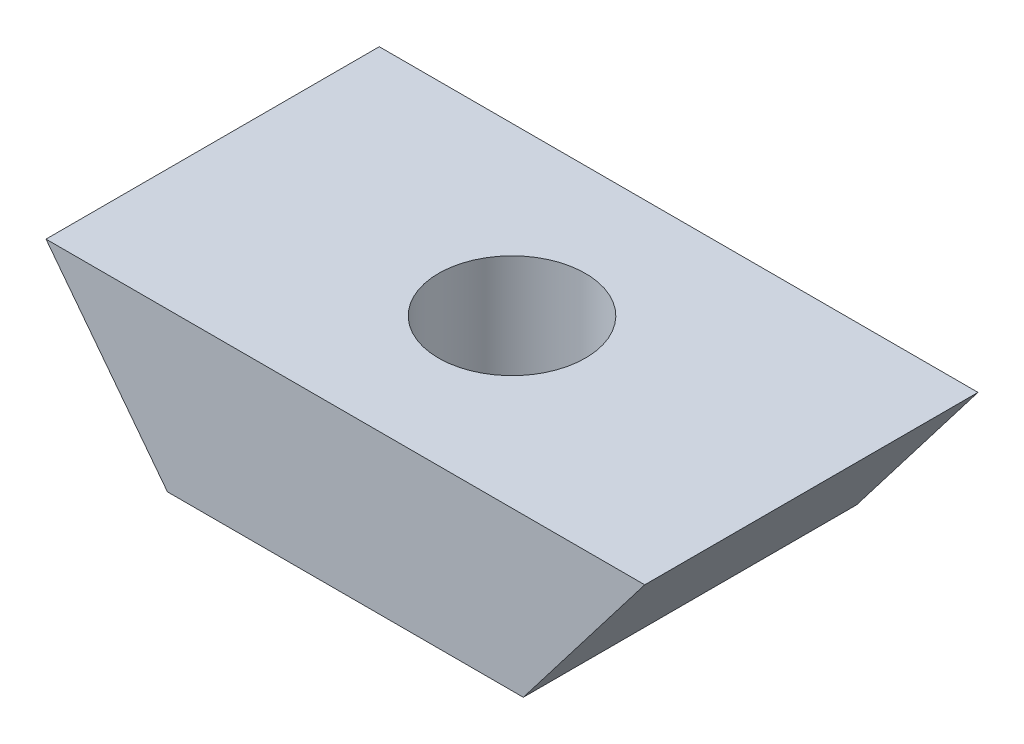
ISO-10303-21;
HEADER;
FILE_DESCRIPTION(('STEP AP214'),'2;1');
FILE_NAME('part.step','',(''),(''),'','','');
FILE_SCHEMA(('AUTOMOTIVE_DESIGN { 1 0 10303 214 1 1 1 1 }'));
ENDSEC;
DATA;
#1=APPLICATION_CONTEXT('core data for automotive mechanical design processes');
#2=APPLICATION_PROTOCOL_DEFINITION('international standard','automotive_design',2000,#1);
#3=PRODUCT_CONTEXT('',#1,'mechanical');
#4=PRODUCT('Part','Part','',(#3));
#5=PRODUCT_RELATED_PRODUCT_CATEGORY('part','',(#4));
#6=PRODUCT_DEFINITION_FORMATION('','',#4);
#7=PRODUCT_DEFINITION_CONTEXT('part definition',#1,'design');
#8=PRODUCT_DEFINITION('design','',#6,#7);
#9=PRODUCT_DEFINITION_SHAPE('','',#8);
#10=(LENGTH_UNIT() NAMED_UNIT(*) SI_UNIT(.MILLI.,.METRE.));
#11=(NAMED_UNIT(*) PLANE_ANGLE_UNIT() SI_UNIT($,.RADIAN.));
#12=(NAMED_UNIT(*) SI_UNIT($,.STERADIAN.) SOLID_ANGLE_UNIT());
#13=UNCERTAINTY_MEASURE_WITH_UNIT(LENGTH_MEASURE(1.E-05),#10,'distance_accuracy_value','');
#14=(GEOMETRIC_REPRESENTATION_CONTEXT(3) GLOBAL_UNCERTAINTY_ASSIGNED_CONTEXT((#13)) GLOBAL_UNIT_ASSIGNED_CONTEXT((#10,
#11,#12)) REPRESENTATION_CONTEXT('',''));
#15=CARTESIAN_POINT('',(0.,0.,0.));
#16=DIRECTION('',(0.,0.,1.));
#17=DIRECTION('',(1.,0.,0.));
#18=AXIS2_PLACEMENT_3D('',#15,#16,#17);
#19=CARTESIAN_POINT('',(2.15,-2.8,5.9));
#20=DIRECTION('',(0.793150213884707,0.609026057090043,0.));
#21=DIRECTION('',(-0.609026057090043,0.793150213884707,0.));
#22=AXIS2_PLACEMENT_3D('',#19,#20,#21);
#23=PLANE('',#22);
#24=DIRECTION('',(0.609026057090043,-0.793150213884707,0.));
#25=VECTOR('',#24,1.);
#26=CARTESIAN_POINT('',(2.15,-2.8,0.));
#27=LINE('',#26,#25);
#28=CARTESIAN_POINT('',(0.,0.,0.));
#29=VERTEX_POINT('',#28);
#30=CARTESIAN_POINT('',(2.15,-2.8,0.));
#31=VERTEX_POINT('',#30);
#32=EDGE_CURVE('E104',#29,#31,#27,.T.);
#33=ORIENTED_EDGE('',*,*,#32,.T.);
#34=DIRECTION('',(0.,0.,-1.));
#35=VECTOR('',#34,1.);
#36=CARTESIAN_POINT('',(2.15,-2.8,5.9));
#37=LINE('',#36,#35);
#38=CARTESIAN_POINT('',(2.15,-2.8,5.9));
#39=VERTEX_POINT('',#38);
#40=EDGE_CURVE('E11',#39,#31,#37,.T.);
#41=ORIENTED_EDGE('',*,*,#40,.F.);
#42=DIRECTION('',(0.609026057090043,-0.793150213884707,0.));
#43=VECTOR('',#42,1.);
#44=CARTESIAN_POINT('',(2.15,-2.8,5.9));
#45=LINE('',#44,#43);
#46=CARTESIAN_POINT('',(0.,0.,5.9));
#47=VERTEX_POINT('',#46);
#48=EDGE_CURVE('E92',#47,#39,#45,.T.);
#49=ORIENTED_EDGE('',*,*,#48,.F.);
#50=DIRECTION('',(0.,0.,-1.));
#51=VECTOR('',#50,1.);
#52=CARTESIAN_POINT('',(0.,0.,5.9));
#53=LINE('',#52,#51);
#54=EDGE_CURVE('E100',#47,#29,#53,.T.);
#55=ORIENTED_EDGE('',*,*,#54,.T.);
#56=EDGE_LOOP('',(#33,#41,#49,#55));
#57=FACE_BOUND('',#56,.T.);
#58=ADVANCED_FACE('F41',(#57),#23,.F.);
#59=CARTESIAN_POINT('',(8.45,-2.8,5.9));
#60=DIRECTION('',(0.,1.,0.));
#61=DIRECTION('',(0.,0.,1.));
#62=AXIS2_PLACEMENT_3D('',#59,#60,#61);
#63=PLANE('',#62);
#64=CARTESIAN_POINT('',(5.3,-2.8,2.95));
#65=DIRECTION('',(0.,1.,0.));
#66=DIRECTION('',(0.,0.,1.));
#67=AXIS2_PLACEMENT_3D('',#64,#65,#66);
#68=CIRCLE('',#67,1.3);
#69=CARTESIAN_POINT('',(5.3,-2.8,4.25));
#70=VERTEX_POINT('',#69);
#71=EDGE_CURVE('E107',#70,#70,#68,.T.);
#72=ORIENTED_EDGE('',*,*,#71,.T.);
#73=EDGE_LOOP('',(#72));
#74=FACE_BOUND('',#73,.T.);
#75=DIRECTION('',(1.,0.,0.));
#76=VECTOR('',#75,1.);
#77=CARTESIAN_POINT('',(8.45,-2.8,0.));
#78=LINE('',#77,#76);
#79=CARTESIAN_POINT('',(8.45,-2.8,0.));
#80=VERTEX_POINT('',#79);
#81=EDGE_CURVE('E96',#31,#80,#78,.T.);
#82=ORIENTED_EDGE('',*,*,#81,.T.);
#83=DIRECTION('',(0.,0.,-1.));
#84=VECTOR('',#83,1.);
#85=CARTESIAN_POINT('',(8.45,-2.8,5.9));
#86=LINE('',#85,#84);
#87=CARTESIAN_POINT('',(8.45,-2.8,5.9));
#88=VERTEX_POINT('',#87);
#89=EDGE_CURVE('E49',#88,#80,#86,.T.);
#90=ORIENTED_EDGE('',*,*,#89,.F.);
#91=DIRECTION('',(1.,0.,0.));
#92=VECTOR('',#91,1.);
#93=CARTESIAN_POINT('',(8.45,-2.8,5.9));
#94=LINE('',#93,#92);
#95=EDGE_CURVE('E87',#39,#88,#94,.T.);
#96=ORIENTED_EDGE('',*,*,#95,.F.);
#97=ORIENTED_EDGE('',*,*,#40,.T.);
#98=EDGE_LOOP('',(#82,#90,#96,#97));
#99=FACE_BOUND('',#98,.T.);
#100=ADVANCED_FACE('F95',(#74,#99),#63,.F.);
#101=CARTESIAN_POINT('',(10.6,0.,5.9));
#102=DIRECTION('',(-0.793150213884707,0.609026057090043,0.));
#103=DIRECTION('',(-0.609026057090043,-0.793150213884707,0.));
#104=AXIS2_PLACEMENT_3D('',#101,#102,#103);
#105=PLANE('',#104);
#106=DIRECTION('',(0.609026057090043,0.793150213884707,0.));
#107=VECTOR('',#106,1.);
#108=CARTESIAN_POINT('',(10.6,0.,0.));
#109=LINE('',#108,#107);
#110=CARTESIAN_POINT('',(10.6,0.,0.));
#111=VERTEX_POINT('',#110);
#112=EDGE_CURVE('E74',#80,#111,#109,.T.);
#113=ORIENTED_EDGE('',*,*,#112,.T.);
#114=DIRECTION('',(0.,0.,-1.));
#115=VECTOR('',#114,1.);
#116=CARTESIAN_POINT('',(10.6,0.,5.9));
#117=LINE('',#116,#115);
#118=CARTESIAN_POINT('',(10.6,0.,5.9));
#119=VERTEX_POINT('',#118);
#120=EDGE_CURVE('E97',#119,#111,#117,.T.);
#121=ORIENTED_EDGE('',*,*,#120,.F.);
#122=DIRECTION('',(0.609026057090043,0.793150213884707,0.));
#123=VECTOR('',#122,1.);
#124=CARTESIAN_POINT('',(10.6,0.,5.9));
#125=LINE('',#124,#123);
#126=EDGE_CURVE('E90',#88,#119,#125,.T.);
#127=ORIENTED_EDGE('',*,*,#126,.F.);
#128=ORIENTED_EDGE('',*,*,#89,.T.);
#129=EDGE_LOOP('',(#113,#121,#127,#128));
#130=FACE_BOUND('',#129,.T.);
#131=ADVANCED_FACE('F98',(#130),#105,.F.);
#132=CARTESIAN_POINT('',(0.,0.,5.9));
#133=DIRECTION('',(0.,-1.,0.));
#134=DIRECTION('',(0.,0.,-1.));
#135=AXIS2_PLACEMENT_3D('',#132,#133,#134);
#136=PLANE('',#135);
#137=CARTESIAN_POINT('',(5.3,0.,2.95));
#138=DIRECTION('',(0.,1.,0.));
#139=DIRECTION('',(0.,0.,1.));
#140=AXIS2_PLACEMENT_3D('',#137,#138,#139);
#141=CIRCLE('',#140,1.3);
#142=CARTESIAN_POINT('',(5.3,0.,4.25));
#143=VERTEX_POINT('',#142);
#144=EDGE_CURVE('E120',#143,#143,#141,.T.);
#145=ORIENTED_EDGE('',*,*,#144,.F.);
#146=EDGE_LOOP('',(#145));
#147=FACE_BOUND('',#146,.T.);
#148=DIRECTION('',(-1.,0.,0.));
#149=VECTOR('',#148,1.);
#150=CARTESIAN_POINT('',(0.,0.,0.));
#151=LINE('',#150,#149);
#152=EDGE_CURVE('E80',#111,#29,#151,.T.);
#153=ORIENTED_EDGE('',*,*,#152,.T.);
#154=ORIENTED_EDGE('',*,*,#54,.F.);
#155=DIRECTION('',(-1.,0.,0.));
#156=VECTOR('',#155,1.);
#157=CARTESIAN_POINT('',(0.,0.,5.9));
#158=LINE('',#157,#156);
#159=EDGE_CURVE('E57',#119,#47,#158,.T.);
#160=ORIENTED_EDGE('',*,*,#159,.F.);
#161=ORIENTED_EDGE('',*,*,#120,.T.);
#162=EDGE_LOOP('',(#153,#154,#160,#161));
#163=FACE_BOUND('',#162,.T.);
#164=ADVANCED_FACE('F112',(#147,#163),#136,.F.);
#165=CARTESIAN_POINT('',(0.,0.,5.9));
#166=DIRECTION('',(0.,0.,1.));
#167=DIRECTION('',(1.,0.,0.));
#168=AXIS2_PLACEMENT_3D('',#165,#166,#167);
#169=PLANE('',#168);
#170=ORIENTED_EDGE('',*,*,#48,.T.);
#171=ORIENTED_EDGE('',*,*,#95,.T.);
#172=ORIENTED_EDGE('',*,*,#126,.T.);
#173=ORIENTED_EDGE('',*,*,#159,.T.);
#174=EDGE_LOOP('',(#170,#171,#172,#173));
#175=FACE_BOUND('',#174,.T.);
#176=ADVANCED_FACE('F88',(#175),#169,.T.);
#177=CARTESIAN_POINT('',(0.,0.,0.));
#178=DIRECTION('',(0.,0.,1.));
#179=DIRECTION('',(1.,0.,0.));
#180=AXIS2_PLACEMENT_3D('',#177,#178,#179);
#181=PLANE('',#180);
#182=ORIENTED_EDGE('',*,*,#32,.F.);
#183=ORIENTED_EDGE('',*,*,#152,.F.);
#184=ORIENTED_EDGE('',*,*,#112,.F.);
#185=ORIENTED_EDGE('',*,*,#81,.F.);
#186=EDGE_LOOP('',(#182,#183,#184,#185));
#187=FACE_BOUND('',#186,.T.);
#188=ADVANCED_FACE('F115',(#187),#181,.F.);
#189=CARTESIAN_POINT('',(5.3,-5.9,2.95));
#190=DIRECTION('',(0.,1.,0.));
#191=DIRECTION('',(0.,0.,1.));
#192=AXIS2_PLACEMENT_3D('',#189,#190,#191);
#193=CYLINDRICAL_SURFACE('',#192,1.3);
#194=ORIENTED_EDGE('',*,*,#144,.T.);
#195=EDGE_LOOP('',(#194));
#196=FACE_BOUND('',#195,.T.);
#197=ORIENTED_EDGE('',*,*,#71,.F.);
#198=EDGE_LOOP('',(#197));
#199=FACE_BOUND('',#198,.T.);
#200=ADVANCED_FACE('F124',(#196,#199),#193,.F.);
#201=CLOSED_SHELL('',(#58,#100,#131,#164,#176,#188,#200));
#202=MANIFOLD_SOLID_BREP('B2',#201);
#203=ADVANCED_BREP_SHAPE_REPRESENTATION('',(#18,#202),#14);
#204=SHAPE_DEFINITION_REPRESENTATION(#9,#203);
ENDSEC;
END-ISO-10303-21;
